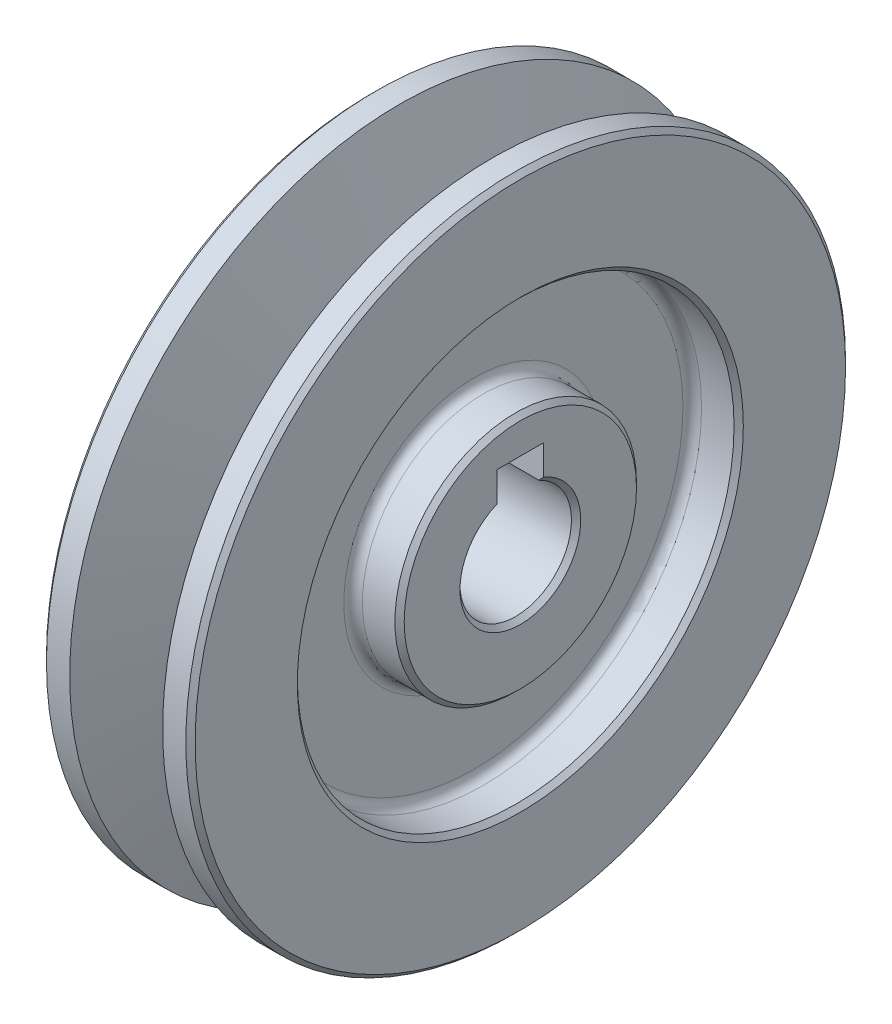
ISO-10303-21;
HEADER;
FILE_DESCRIPTION(('STEP AP214'),'2;1');
FILE_NAME('part.step','',(''),(''),'','','');
FILE_SCHEMA(('AUTOMOTIVE_DESIGN { 1 0 10303 214 1 1 1 1 }'));
ENDSEC;
DATA;
#1=APPLICATION_CONTEXT('core data for automotive mechanical design processes');
#2=APPLICATION_PROTOCOL_DEFINITION('international standard','automotive_design',2000,#1);
#3=PRODUCT_CONTEXT('',#1,'mechanical');
#4=PRODUCT('Part','Part','',(#3));
#5=PRODUCT_RELATED_PRODUCT_CATEGORY('part','',(#4));
#6=PRODUCT_DEFINITION_FORMATION('','',#4);
#7=PRODUCT_DEFINITION_CONTEXT('part definition',#1,'design');
#8=PRODUCT_DEFINITION('design','',#6,#7);
#9=PRODUCT_DEFINITION_SHAPE('','',#8);
#10=(LENGTH_UNIT() NAMED_UNIT(*) SI_UNIT(.MILLI.,.METRE.));
#11=(NAMED_UNIT(*) PLANE_ANGLE_UNIT() SI_UNIT($,.RADIAN.));
#12=(NAMED_UNIT(*) SI_UNIT($,.STERADIAN.) SOLID_ANGLE_UNIT());
#13=UNCERTAINTY_MEASURE_WITH_UNIT(LENGTH_MEASURE(1.E-05),#10,'distance_accuracy_value','');
#14=(GEOMETRIC_REPRESENTATION_CONTEXT(3) GLOBAL_UNCERTAINTY_ASSIGNED_CONTEXT((#13)) GLOBAL_UNIT_ASSIGNED_CONTEXT((#10,
#11,#12)) REPRESENTATION_CONTEXT('',''));
#15=CARTESIAN_POINT('',(0.,0.,0.));
#16=DIRECTION('',(0.,0.,1.));
#17=DIRECTION('',(1.,0.,0.));
#18=AXIS2_PLACEMENT_3D('',#15,#16,#17);
#19=CARTESIAN_POINT('',(0.,0.,0.));
#20=DIRECTION('',(1.,0.,0.));
#21=DIRECTION('',(0.,0.,-1.));
#22=AXIS2_PLACEMENT_3D('',#19,#20,#21);
#23=CYLINDRICAL_SURFACE('',#22,35.5);
#24=CARTESIAN_POINT('',(-7.49999999999999,0.,0.));
#25=DIRECTION('',(-1.,0.,0.));
#26=DIRECTION('',(0.,0.,1.));
#27=AXIS2_PLACEMENT_3D('',#24,#25,#26);
#28=CIRCLE('',#27,35.5);
#29=CARTESIAN_POINT('',(-7.49999999999999,0.,35.5));
#30=VERTEX_POINT('',#29);
#31=EDGE_CURVE('E319',#30,#30,#28,.F.);
#32=ORIENTED_EDGE('',*,*,#31,.T.);
#33=EDGE_LOOP('',(#32));
#34=FACE_BOUND('',#33,.T.);
#35=CARTESIAN_POINT('',(-5.,0.,0.));
#36=DIRECTION('',(1.,0.,0.));
#37=DIRECTION('',(0.,0.,-1.));
#38=AXIS2_PLACEMENT_3D('',#35,#36,#37);
#39=CIRCLE('',#38,35.5);
#40=CARTESIAN_POINT('',(-5.,0.,-35.5));
#41=VERTEX_POINT('',#40);
#42=EDGE_CURVE('E367',#41,#41,#39,.T.);
#43=ORIENTED_EDGE('',*,*,#42,.F.);
#44=EDGE_LOOP('',(#43));
#45=FACE_BOUND('',#44,.T.);
#46=ADVANCED_FACE('F38',(#34,#45),#23,.T.);
#47=CARTESIAN_POINT('',(-1.94269318541343,0.,0.));
#48=DIRECTION('',(-1.,0.,0.));
#49=DIRECTION('',(0.,0.,1.));
#50=AXIS2_PLACEMENT_3D('',#47,#48,#49);
#51=CONICAL_SURFACE('',#50,25.5,1.27409035395586);
#52=ORIENTED_EDGE('',*,*,#42,.T.);
#53=EDGE_LOOP('',(#52));
#54=FACE_BOUND('',#53,.T.);
#55=CARTESIAN_POINT('',(-1.94269318541343,0.,0.));
#56=DIRECTION('',(1.,0.,0.));
#57=DIRECTION('',(0.,0.,-1.));
#58=AXIS2_PLACEMENT_3D('',#55,#56,#57);
#59=CIRCLE('',#58,25.5);
#60=CARTESIAN_POINT('',(-1.94269318541343,0.,-25.5));
#61=VERTEX_POINT('',#60);
#62=EDGE_CURVE('E370',#61,#61,#59,.T.);
#63=ORIENTED_EDGE('',*,*,#62,.F.);
#64=EDGE_LOOP('',(#63));
#65=FACE_BOUND('',#64,.T.);
#66=ADVANCED_FACE('F213',(#54,#65),#51,.T.);
#67=CARTESIAN_POINT('',(0.,0.,0.));
#68=DIRECTION('',(1.,0.,0.));
#69=DIRECTION('',(0.,0.,-1.));
#70=AXIS2_PLACEMENT_3D('',#67,#68,#69);
#71=CYLINDRICAL_SURFACE('',#70,25.5);
#72=ORIENTED_EDGE('',*,*,#62,.T.);
#73=EDGE_LOOP('',(#72));
#74=FACE_BOUND('',#73,.T.);
#75=CARTESIAN_POINT('',(1.94269318541343,0.,0.));
#76=DIRECTION('',(1.,0.,0.));
#77=DIRECTION('',(0.,0.,-1.));
#78=AXIS2_PLACEMENT_3D('',#75,#76,#77);
#79=CIRCLE('',#78,25.5);
#80=CARTESIAN_POINT('',(1.94269318541343,0.,-25.5));
#81=VERTEX_POINT('',#80);
#82=EDGE_CURVE('E373',#81,#81,#79,.T.);
#83=ORIENTED_EDGE('',*,*,#82,.F.);
#84=EDGE_LOOP('',(#83));
#85=FACE_BOUND('',#84,.T.);
#86=ADVANCED_FACE('F218',(#74,#85),#71,.T.);
#87=CARTESIAN_POINT('',(5.,0.,0.));
#88=DIRECTION('',(1.,0.,0.));
#89=DIRECTION('',(0.,0.,-1.));
#90=AXIS2_PLACEMENT_3D('',#87,#88,#89);
#91=CONICAL_SURFACE('',#90,35.5,1.27409035395586);
#92=ORIENTED_EDGE('',*,*,#82,.T.);
#93=EDGE_LOOP('',(#92));
#94=FACE_BOUND('',#93,.T.);
#95=CARTESIAN_POINT('',(5.,0.,0.));
#96=DIRECTION('',(1.,0.,0.));
#97=DIRECTION('',(0.,0.,-1.));
#98=AXIS2_PLACEMENT_3D('',#95,#96,#97);
#99=CIRCLE('',#98,35.5);
#100=CARTESIAN_POINT('',(5.,0.,-35.5));
#101=VERTEX_POINT('',#100);
#102=EDGE_CURVE('E376',#101,#101,#99,.T.);
#103=ORIENTED_EDGE('',*,*,#102,.F.);
#104=EDGE_LOOP('',(#103));
#105=FACE_BOUND('',#104,.T.);
#106=ADVANCED_FACE('F226',(#94,#105),#91,.T.);
#107=CARTESIAN_POINT('',(0.,0.,0.));
#108=DIRECTION('',(1.,0.,0.));
#109=DIRECTION('',(0.,0.,-1.));
#110=AXIS2_PLACEMENT_3D('',#107,#108,#109);
#111=CYLINDRICAL_SURFACE('',#110,35.5);
#112=CARTESIAN_POINT('',(7.50000000000002,0.,0.));
#113=DIRECTION('',(1.,0.,0.));
#114=DIRECTION('',(0.,0.,-1.));
#115=AXIS2_PLACEMENT_3D('',#112,#113,#114);
#116=CIRCLE('',#115,35.5);
#117=CARTESIAN_POINT('',(7.50000000000002,0.,-35.5));
#118=VERTEX_POINT('',#117);
#119=EDGE_CURVE('E305',#118,#118,#116,.F.);
#120=ORIENTED_EDGE('',*,*,#119,.T.);
#121=EDGE_LOOP('',(#120));
#122=FACE_BOUND('',#121,.T.);
#123=ORIENTED_EDGE('',*,*,#102,.T.);
#124=EDGE_LOOP('',(#123));
#125=FACE_BOUND('',#124,.T.);
#126=ADVANCED_FACE('F230',(#122,#125),#111,.T.);
#127=CARTESIAN_POINT('',(8.,0.,-35.5));
#128=DIRECTION('',(1.,0.,0.));
#129=DIRECTION('',(0.,0.,-1.));
#130=AXIS2_PLACEMENT_3D('',#127,#128,#129);
#131=PLANE('',#130);
#132=CARTESIAN_POINT('',(8.,0.,0.));
#133=DIRECTION('',(1.,0.,0.));
#134=DIRECTION('',(0.,0.,-1.));
#135=AXIS2_PLACEMENT_3D('',#132,#133,#134);
#136=CIRCLE('',#135,24.);
#137=CARTESIAN_POINT('',(8.,0.,-24.));
#138=VERTEX_POINT('',#137);
#139=EDGE_CURVE('E11',#138,#138,#136,.F.);
#140=ORIENTED_EDGE('',*,*,#139,.T.);
#141=EDGE_LOOP('',(#140));
#142=FACE_BOUND('',#141,.T.);
#143=CARTESIAN_POINT('',(8.,0.,0.));
#144=DIRECTION('',(1.,0.,0.));
#145=DIRECTION('',(0.,0.,-1.));
#146=AXIS2_PLACEMENT_3D('',#143,#144,#145);
#147=CIRCLE('',#146,35.);
#148=CARTESIAN_POINT('',(8.,0.,-35.));
#149=VERTEX_POINT('',#148);
#150=EDGE_CURVE('E310',#149,#149,#147,.T.);
#151=ORIENTED_EDGE('',*,*,#150,.T.);
#152=EDGE_LOOP('',(#151));
#153=FACE_BOUND('',#152,.T.);
#154=ADVANCED_FACE('F234',(#142,#153),#131,.T.);
#155=CARTESIAN_POINT('',(0.,0.,0.));
#156=DIRECTION('',(1.,0.,0.));
#157=DIRECTION('',(0.,0.,-1.));
#158=AXIS2_PLACEMENT_3D('',#155,#156,#157);
#159=CYLINDRICAL_SURFACE('',#158,23.5);
#160=CARTESIAN_POINT('',(7.49999999999998,0.,0.));
#161=DIRECTION('',(1.,0.,0.));
#162=DIRECTION('',(0.,0.,-1.));
#163=AXIS2_PLACEMENT_3D('',#160,#161,#162);
#164=CIRCLE('',#163,23.5);
#165=CARTESIAN_POINT('',(7.49999999999998,0.,-23.5));
#166=VERTEX_POINT('',#165);
#167=EDGE_CURVE('E47',#166,#166,#164,.T.);
#168=ORIENTED_EDGE('',*,*,#167,.T.);
#169=EDGE_LOOP('',(#168));
#170=FACE_BOUND('',#169,.T.);
#171=CARTESIAN_POINT('',(4.,0.,0.));
#172=DIRECTION('',(1.,0.,0.));
#173=DIRECTION('',(0.,0.,-1.));
#174=AXIS2_PLACEMENT_3D('',#171,#172,#173);
#175=CIRCLE('',#174,23.5);
#176=CARTESIAN_POINT('',(4.,0.,-23.5));
#177=VERTEX_POINT('',#176);
#178=EDGE_CURVE('E341',#177,#177,#175,.F.);
#179=ORIENTED_EDGE('',*,*,#178,.T.);
#180=EDGE_LOOP('',(#179));
#181=FACE_BOUND('',#180,.T.);
#182=ADVANCED_FACE('F238',(#170,#181),#159,.F.);
#183=CARTESIAN_POINT('',(3.,0.,-23.5));
#184=DIRECTION('',(1.,0.,0.));
#185=DIRECTION('',(0.,0.,-1.));
#186=AXIS2_PLACEMENT_3D('',#183,#184,#185);
#187=PLANE('',#186);
#188=CARTESIAN_POINT('',(3.,0.,0.));
#189=DIRECTION('',(1.,0.,0.));
#190=DIRECTION('',(0.,0.,-1.));
#191=AXIS2_PLACEMENT_3D('',#188,#189,#190);
#192=CIRCLE('',#191,14.);
#193=CARTESIAN_POINT('',(3.,0.,-14.));
#194=VERTEX_POINT('',#193);
#195=EDGE_CURVE('E336',#194,#194,#192,.F.);
#196=ORIENTED_EDGE('',*,*,#195,.T.);
#197=EDGE_LOOP('',(#196));
#198=FACE_BOUND('',#197,.T.);
#199=CARTESIAN_POINT('',(3.,0.,0.));
#200=DIRECTION('',(1.,0.,0.));
#201=DIRECTION('',(0.,0.,-1.));
#202=AXIS2_PLACEMENT_3D('',#199,#200,#201);
#203=CIRCLE('',#202,22.5);
#204=CARTESIAN_POINT('',(3.,0.,-22.5));
#205=VERTEX_POINT('',#204);
#206=EDGE_CURVE('E333',#205,#205,#203,.T.);
#207=ORIENTED_EDGE('',*,*,#206,.T.);
#208=EDGE_LOOP('',(#207));
#209=FACE_BOUND('',#208,.T.);
#210=ADVANCED_FACE('F242',(#198,#209),#187,.T.);
#211=CARTESIAN_POINT('',(0.,0.,0.));
#212=DIRECTION('',(1.,0.,0.));
#213=DIRECTION('',(0.,0.,-1.));
#214=AXIS2_PLACEMENT_3D('',#211,#212,#213);
#215=CYLINDRICAL_SURFACE('',#214,13.);
#216=CARTESIAN_POINT('',(4.,0.,0.));
#217=DIRECTION('',(1.,0.,0.));
#218=DIRECTION('',(0.,0.,-1.));
#219=AXIS2_PLACEMENT_3D('',#216,#217,#218);
#220=CIRCLE('',#219,13.);
#221=CARTESIAN_POINT('',(4.,0.,-13.));
#222=VERTEX_POINT('',#221);
#223=EDGE_CURVE('E331',#222,#222,#220,.T.);
#224=ORIENTED_EDGE('',*,*,#223,.T.);
#225=EDGE_LOOP('',(#224));
#226=FACE_BOUND('',#225,.T.);
#227=CARTESIAN_POINT('',(7.50000000000002,0.,0.));
#228=DIRECTION('',(1.,0.,0.));
#229=DIRECTION('',(0.,0.,-1.));
#230=AXIS2_PLACEMENT_3D('',#227,#228,#229);
#231=CIRCLE('',#230,13.);
#232=CARTESIAN_POINT('',(7.50000000000002,0.,-13.));
#233=VERTEX_POINT('',#232);
#234=EDGE_CURVE('E354',#233,#233,#231,.F.);
#235=ORIENTED_EDGE('',*,*,#234,.T.);
#236=EDGE_LOOP('',(#235));
#237=FACE_BOUND('',#236,.T.);
#238=ADVANCED_FACE('F246',(#226,#237),#215,.T.);
#239=CARTESIAN_POINT('',(8.,0.,-13.));
#240=DIRECTION('',(1.,0.,0.));
#241=DIRECTION('',(0.,0.,-1.));
#242=AXIS2_PLACEMENT_3D('',#239,#240,#241);
#243=PLANE('',#242);
#244=DIRECTION('',(0.,-1.,0.));
#245=VECTOR('',#244,1.);
#246=CARTESIAN_POINT('',(8.,9.2,2.5));
#247=LINE('',#246,#245);
#248=CARTESIAN_POINT('',(8.,9.2,2.5));
#249=VERTEX_POINT('',#248);
#250=CARTESIAN_POINT('',(8.,6.00000000000001,2.5));
#251=VERTEX_POINT('',#250);
#252=EDGE_CURVE('E113',#249,#251,#247,.T.);
#253=ORIENTED_EDGE('',*,*,#252,.F.);
#254=DIRECTION('',(0.,0.,1.));
#255=VECTOR('',#254,1.);
#256=CARTESIAN_POINT('',(8.,9.2,2.5));
#257=LINE('',#256,#255);
#258=CARTESIAN_POINT('',(8.,9.2,-2.5));
#259=VERTEX_POINT('',#258);
#260=EDGE_CURVE('E115',#259,#249,#257,.T.);
#261=ORIENTED_EDGE('',*,*,#260,.F.);
#262=DIRECTION('',(0.,1.,0.));
#263=VECTOR('',#262,1.);
#264=CARTESIAN_POINT('',(8.,9.2,-2.5));
#265=LINE('',#264,#263);
#266=CARTESIAN_POINT('',(8.,6.00000000000001,-2.5));
#267=VERTEX_POINT('',#266);
#268=EDGE_CURVE('E94',#267,#259,#265,.T.);
#269=ORIENTED_EDGE('',*,*,#268,.F.);
#270=CARTESIAN_POINT('',(8.,0.,0.));
#271=DIRECTION('',(1.,0.,0.));
#272=DIRECTION('',(0.,0.,-1.));
#273=AXIS2_PLACEMENT_3D('',#270,#271,#272);
#274=CIRCLE('',#273,6.50000000000001);
#275=EDGE_CURVE('E356',#267,#251,#274,.F.);
#276=ORIENTED_EDGE('',*,*,#275,.T.);
#277=EDGE_LOOP('',(#253,#261,#269,#276));
#278=FACE_BOUND('',#277,.T.);
#279=CARTESIAN_POINT('',(8.,0.,0.));
#280=DIRECTION('',(1.,0.,0.));
#281=DIRECTION('',(0.,0.,-1.));
#282=AXIS2_PLACEMENT_3D('',#279,#280,#281);
#283=CIRCLE('',#282,12.5);
#284=CARTESIAN_POINT('',(8.,0.,-12.5));
#285=VERTEX_POINT('',#284);
#286=EDGE_CURVE('E360',#285,#285,#283,.T.);
#287=ORIENTED_EDGE('',*,*,#286,.T.);
#288=EDGE_LOOP('',(#287));
#289=FACE_BOUND('',#288,.T.);
#290=ADVANCED_FACE('F250',(#278,#289),#243,.T.);
#291=CARTESIAN_POINT('',(0.,0.,0.));
#292=DIRECTION('',(1.,0.,0.));
#293=DIRECTION('',(0.,0.,-1.));
#294=AXIS2_PLACEMENT_3D('',#291,#292,#293);
#295=CYLINDRICAL_SURFACE('',#294,6.);
#296=DIRECTION('',(1.,0.,0.));
#297=VECTOR('',#296,1.);
#298=CARTESIAN_POINT('',(0.,5.45435605731786,2.5));
#299=LINE('',#298,#297);
#300=CARTESIAN_POINT('',(7.49999999999999,5.45435605731786,2.5));
#301=VERTEX_POINT('',#300);
#302=CARTESIAN_POINT('',(-7.50000000000001,5.4543560573179,2.5));
#303=VERTEX_POINT('',#302);
#304=EDGE_CURVE('E132',#301,#303,#299,.F.);
#305=ORIENTED_EDGE('',*,*,#304,.F.);
#306=CARTESIAN_POINT('',(7.49999999999999,0.,0.));
#307=DIRECTION('',(1.,0.,0.));
#308=DIRECTION('',(0.,0.,-1.));
#309=AXIS2_PLACEMENT_3D('',#306,#307,#308);
#310=CIRCLE('',#309,6.);
#311=CARTESIAN_POINT('',(7.49999999999999,5.45435605731786,-2.5));
#312=VERTEX_POINT('',#311);
#313=EDGE_CURVE('E365',#301,#312,#310,.T.);
#314=ORIENTED_EDGE('',*,*,#313,.T.);
#315=DIRECTION('',(1.,0.,0.));
#316=VECTOR('',#315,1.);
#317=CARTESIAN_POINT('',(0.,5.45435605731786,-2.5));
#318=LINE('',#317,#316);
#319=CARTESIAN_POINT('',(-7.49999999999999,5.45435605731786,-2.5));
#320=VERTEX_POINT('',#319);
#321=EDGE_CURVE('E121',#320,#312,#318,.T.);
#322=ORIENTED_EDGE('',*,*,#321,.F.);
#323=CARTESIAN_POINT('',(-7.49999999999999,0.,0.));
#324=DIRECTION('',(-1.,0.,0.));
#325=DIRECTION('',(0.,0.,1.));
#326=AXIS2_PLACEMENT_3D('',#323,#324,#325);
#327=CIRCLE('',#326,6.);
#328=EDGE_CURVE('E316',#320,#303,#327,.T.);
#329=ORIENTED_EDGE('',*,*,#328,.T.);
#330=EDGE_LOOP('',(#305,#314,#322,#329));
#331=FACE_BOUND('',#330,.T.);
#332=ADVANCED_FACE('F254',(#331),#295,.F.);
#333=CARTESIAN_POINT('',(-8.,0.,-6.));
#334=DIRECTION('',(-1.,0.,0.));
#335=DIRECTION('',(0.,0.,1.));
#336=AXIS2_PLACEMENT_3D('',#333,#334,#335);
#337=PLANE('',#336);
#338=DIRECTION('',(0.,-1.,0.));
#339=VECTOR('',#338,1.);
#340=CARTESIAN_POINT('',(-8.,9.2,2.5));
#341=LINE('',#340,#339);
#342=CARTESIAN_POINT('',(-8.,9.2,2.5));
#343=VERTEX_POINT('',#342);
#344=CARTESIAN_POINT('',(-8.,6.00000000000002,2.5));
#345=VERTEX_POINT('',#344);
#346=EDGE_CURVE('E99',#343,#345,#341,.T.);
#347=ORIENTED_EDGE('',*,*,#346,.T.);
#348=CARTESIAN_POINT('',(-8.,0.,0.));
#349=DIRECTION('',(-1.,0.,0.));
#350=DIRECTION('',(0.,0.,1.));
#351=AXIS2_PLACEMENT_3D('',#348,#349,#350);
#352=CIRCLE('',#351,6.50000000000002);
#353=CARTESIAN_POINT('',(-8.,6.00000000000002,-2.5));
#354=VERTEX_POINT('',#353);
#355=EDGE_CURVE('E112',#345,#354,#352,.F.);
#356=ORIENTED_EDGE('',*,*,#355,.T.);
#357=DIRECTION('',(0.,1.,0.));
#358=VECTOR('',#357,1.);
#359=CARTESIAN_POINT('',(-8.,4.68945343674492,-2.5));
#360=LINE('',#359,#358);
#361=CARTESIAN_POINT('',(-8.,9.2,-2.5));
#362=VERTEX_POINT('',#361);
#363=EDGE_CURVE('E54',#354,#362,#360,.T.);
#364=ORIENTED_EDGE('',*,*,#363,.T.);
#365=DIRECTION('',(0.,0.,1.));
#366=VECTOR('',#365,1.);
#367=CARTESIAN_POINT('',(-8.,9.2,2.5));
#368=LINE('',#367,#366);
#369=EDGE_CURVE('E102',#362,#343,#368,.T.);
#370=ORIENTED_EDGE('',*,*,#369,.T.);
#371=EDGE_LOOP('',(#347,#356,#364,#370));
#372=FACE_BOUND('',#371,.T.);
#373=CARTESIAN_POINT('',(-8.,0.,0.));
#374=DIRECTION('',(-1.,0.,0.));
#375=DIRECTION('',(0.,0.,1.));
#376=AXIS2_PLACEMENT_3D('',#373,#374,#375);
#377=CIRCLE('',#376,12.5);
#378=CARTESIAN_POINT('',(-8.,0.,12.5));
#379=VERTEX_POINT('',#378);
#380=EDGE_CURVE('E307',#379,#379,#377,.T.);
#381=ORIENTED_EDGE('',*,*,#380,.T.);
#382=EDGE_LOOP('',(#381));
#383=FACE_BOUND('',#382,.T.);
#384=ADVANCED_FACE('F109',(#372,#383),#337,.T.);
#385=CARTESIAN_POINT('',(0.,0.,0.));
#386=DIRECTION('',(1.,0.,0.));
#387=DIRECTION('',(0.,0.,-1.));
#388=AXIS2_PLACEMENT_3D('',#385,#386,#387);
#389=CYLINDRICAL_SURFACE('',#388,13.);
#390=CARTESIAN_POINT('',(-4.,0.,0.));
#391=DIRECTION('',(-1.,0.,0.));
#392=DIRECTION('',(0.,0.,1.));
#393=AXIS2_PLACEMENT_3D('',#390,#391,#392);
#394=CIRCLE('',#393,13.);
#395=CARTESIAN_POINT('',(-4.,0.,13.));
#396=VERTEX_POINT('',#395);
#397=EDGE_CURVE('E158',#396,#396,#394,.T.);
#398=ORIENTED_EDGE('',*,*,#397,.T.);
#399=EDGE_LOOP('',(#398));
#400=FACE_BOUND('',#399,.T.);
#401=CARTESIAN_POINT('',(-7.50000000000002,0.,0.));
#402=DIRECTION('',(-1.,0.,0.));
#403=DIRECTION('',(0.,0.,1.));
#404=AXIS2_PLACEMENT_3D('',#401,#402,#403);
#405=CIRCLE('',#404,13.);
#406=CARTESIAN_POINT('',(-7.50000000000002,0.,13.));
#407=VERTEX_POINT('',#406);
#408=EDGE_CURVE('E303',#407,#407,#405,.F.);
#409=ORIENTED_EDGE('',*,*,#408,.T.);
#410=EDGE_LOOP('',(#409));
#411=FACE_BOUND('',#410,.T.);
#412=ADVANCED_FACE('F261',(#400,#411),#389,.T.);
#413=CARTESIAN_POINT('',(-3.,0.,-13.));
#414=DIRECTION('',(-1.,0.,0.));
#415=DIRECTION('',(0.,0.,1.));
#416=AXIS2_PLACEMENT_3D('',#413,#414,#415);
#417=PLANE('',#416);
#418=CARTESIAN_POINT('',(-3.,0.,0.));
#419=DIRECTION('',(-1.,0.,0.));
#420=DIRECTION('',(0.,0.,1.));
#421=AXIS2_PLACEMENT_3D('',#418,#419,#420);
#422=CIRCLE('',#421,22.5);
#423=CARTESIAN_POINT('',(-3.,0.,22.5));
#424=VERTEX_POINT('',#423);
#425=EDGE_CURVE('E292',#424,#424,#422,.T.);
#426=ORIENTED_EDGE('',*,*,#425,.T.);
#427=EDGE_LOOP('',(#426));
#428=FACE_BOUND('',#427,.T.);
#429=CARTESIAN_POINT('',(-3.,0.,0.));
#430=DIRECTION('',(-1.,0.,0.));
#431=DIRECTION('',(0.,0.,1.));
#432=AXIS2_PLACEMENT_3D('',#429,#430,#431);
#433=CIRCLE('',#432,14.);
#434=CARTESIAN_POINT('',(-3.,0.,14.));
#435=VERTEX_POINT('',#434);
#436=EDGE_CURVE('E284',#435,#435,#433,.F.);
#437=ORIENTED_EDGE('',*,*,#436,.T.);
#438=EDGE_LOOP('',(#437));
#439=FACE_BOUND('',#438,.T.);
#440=ADVANCED_FACE('F264',(#428,#439),#417,.T.);
#441=CARTESIAN_POINT('',(0.,0.,0.));
#442=DIRECTION('',(1.,0.,0.));
#443=DIRECTION('',(0.,0.,-1.));
#444=AXIS2_PLACEMENT_3D('',#441,#442,#443);
#445=CYLINDRICAL_SURFACE('',#444,23.5);
#446=CARTESIAN_POINT('',(-4.,0.,0.));
#447=DIRECTION('',(-1.,0.,0.));
#448=DIRECTION('',(0.,0.,1.));
#449=AXIS2_PLACEMENT_3D('',#446,#447,#448);
#450=CIRCLE('',#449,23.5);
#451=CARTESIAN_POINT('',(-4.,0.,23.5));
#452=VERTEX_POINT('',#451);
#453=EDGE_CURVE('E278',#452,#452,#450,.F.);
#454=ORIENTED_EDGE('',*,*,#453,.T.);
#455=EDGE_LOOP('',(#454));
#456=FACE_BOUND('',#455,.T.);
#457=CARTESIAN_POINT('',(-7.49999999999997,0.,0.));
#458=DIRECTION('',(-1.,0.,0.));
#459=DIRECTION('',(0.,0.,1.));
#460=AXIS2_PLACEMENT_3D('',#457,#458,#459);
#461=CIRCLE('',#460,23.5);
#462=CARTESIAN_POINT('',(-7.49999999999997,0.,23.5));
#463=VERTEX_POINT('',#462);
#464=EDGE_CURVE('E281',#463,#463,#461,.T.);
#465=ORIENTED_EDGE('',*,*,#464,.T.);
#466=EDGE_LOOP('',(#465));
#467=FACE_BOUND('',#466,.T.);
#468=ADVANCED_FACE('F267',(#456,#467),#445,.F.);
#469=CARTESIAN_POINT('',(-8.,0.,-35.5));
#470=DIRECTION('',(-1.,0.,0.));
#471=DIRECTION('',(0.,0.,1.));
#472=AXIS2_PLACEMENT_3D('',#469,#470,#471);
#473=PLANE('',#472);
#474=CARTESIAN_POINT('',(-8.,0.,0.));
#475=DIRECTION('',(-1.,0.,0.));
#476=DIRECTION('',(0.,0.,1.));
#477=AXIS2_PLACEMENT_3D('',#474,#475,#476);
#478=CIRCLE('',#477,35.);
#479=CARTESIAN_POINT('',(-8.,0.,35.));
#480=VERTEX_POINT('',#479);
#481=EDGE_CURVE('E282',#480,#480,#478,.T.);
#482=ORIENTED_EDGE('',*,*,#481,.T.);
#483=EDGE_LOOP('',(#482));
#484=FACE_BOUND('',#483,.T.);
#485=CARTESIAN_POINT('',(-8.,0.,0.));
#486=DIRECTION('',(-1.,0.,0.));
#487=DIRECTION('',(0.,0.,1.));
#488=AXIS2_PLACEMENT_3D('',#485,#486,#487);
#489=CIRCLE('',#488,24.);
#490=CARTESIAN_POINT('',(-8.,0.,24.));
#491=VERTEX_POINT('',#490);
#492=EDGE_CURVE('E287',#491,#491,#489,.F.);
#493=ORIENTED_EDGE('',*,*,#492,.T.);
#494=EDGE_LOOP('',(#493));
#495=FACE_BOUND('',#494,.T.);
#496=ADVANCED_FACE('F145',(#484,#495),#473,.T.);
#497=CARTESIAN_POINT('',(7.49999999999999,0.,0.));
#498=DIRECTION('',(1.,0.,0.));
#499=DIRECTION('',(0.,0.,-1.));
#500=AXIS2_PLACEMENT_3D('',#497,#498,#499);
#501=CONICAL_SURFACE('',#500,6.,0.785398163397441);
#502=CARTESIAN_POINT('',(9.87851809279334,7.996847218202,2.5));
#503=CARTESIAN_POINT('',(9.69561827611088,7.80520044614911,2.5));
#504=CARTESIAN_POINT('',(9.5130073335574,7.61327653402442,2.5));
#505=CARTESIAN_POINT('',(9.14855219902151,7.22870604888692,2.5));
#506=CARTESIAN_POINT('',(8.96670799917428,7.03605948332519,2.5));
#507=CARTESIAN_POINT('',(8.60404204743516,6.64994639611863,2.5));
#508=CARTESIAN_POINT('',(8.42321992575596,6.45648022211701,2.5));
#509=CARTESIAN_POINT('',(8.06279838271433,6.06840260436788,2.5));
#510=CARTESIAN_POINT('',(7.88319898960132,5.87379113435229,2.5));
#511=CARTESIAN_POINT('',(7.52554607774594,5.48301097494807,2.5));
#512=CARTESIAN_POINT('',(7.34749319295693,5.28684170472391,2.5));
#513=CARTESIAN_POINT('',(6.99358157546478,4.8925481062318,2.5));
#514=CARTESIAN_POINT('',(6.81772271175028,4.69442389597646,2.5));
#515=CARTESIAN_POINT('',(6.55620812543917,4.39517613706631,2.5));
#516=CARTESIAN_POINT('',(6.46939751014354,4.29506201434628,2.5));
#517=CARTESIAN_POINT('',(6.29671225385518,4.09403209186591,2.5));
#518=CARTESIAN_POINT('',(6.21083759609687,3.99311630652171,2.5));
#519=CARTESIAN_POINT('',(6.04020215400039,3.79031073202054,2.5));
#520=CARTESIAN_POINT('',(5.95544159505808,3.68842075276124,2.5));
#521=CARTESIAN_POINT('',(5.78733115235289,3.48347406734019,2.5));
#522=CARTESIAN_POINT('',(5.70398135652027,3.38041728911725,2.5));
#523=CARTESIAN_POINT('',(5.62148190720665,3.27667714482707,2.5));
#524=B_SPLINE_CURVE_WITH_KNOTS('',3,(#502,#503,#504,#505,#506,#507,#508,#509,#510,#511,#512,
#513,#514,#515,#516,#517,#518,#519,#520,#521,#522,#523),.UNSPECIFIED.,.F.,.F.,(4,2,2,2,2,2,2,2,
2,2,4),(0.,0.794751211136146,1.58949425022396,2.38392852041293,3.17838108301331,
3.97314524653587,4.76786172303218,5.16538739146731,5.56290592737695,5.96050368522883,
6.35812613402777),.UNSPECIFIED.);
#525=EDGE_CURVE('E62',#251,#301,#524,.T.);
#526=ORIENTED_EDGE('',*,*,#525,.F.);
#527=ORIENTED_EDGE('',*,*,#275,.F.);
#528=CARTESIAN_POINT('',(5.62148190720664,3.27667714482706,-2.5));
#529=CARTESIAN_POINT('',(5.68423462608521,3.3555999877722,-2.5));
#530=CARTESIAN_POINT('',(5.74748764959992,3.4341219087837,-2.5));
#531=CARTESIAN_POINT('',(5.87485352934888,3.59046116823555,-2.5));
#532=CARTESIAN_POINT('',(5.9389663557458,3.66827853096967,-2.5));
#533=CARTESIAN_POINT('',(6.13237272244433,3.90080708242088,-2.5));
#534=CARTESIAN_POINT('',(6.26275100510174,4.05461578565748,-2.5));
#535=CARTESIAN_POINT('',(6.52559307541641,4.36035182254918,-2.5));
#536=CARTESIAN_POINT('',(6.65805621189684,4.51227971816509,-2.5));
#537=CARTESIAN_POINT('',(6.92460741261318,4.81471172570076,-2.5));
#538=CARTESIAN_POINT('',(7.05869554016978,4.96521578172852,-2.5));
#539=CARTESIAN_POINT('',(7.46269843747693,5.4149083727013,-2.5));
#540=CARTESIAN_POINT('',(7.73447669189982,5.71242116428814,-2.5));
#541=CARTESIAN_POINT('',(8.28119506085875,6.30455479295837,-2.5));
#542=CARTESIAN_POINT('',(8.55613540608599,6.59917541609902,-2.5));
#543=CARTESIAN_POINT('',(8.91897175935182,6.98513549258517,-2.5));
#544=CARTESIAN_POINT('',(9.00589814622697,7.07738820553484,-2.5));
#545=CARTESIAN_POINT('',(9.17994156895429,7.26170966899727,-2.5));
#546=CARTESIAN_POINT('',(9.26705860037213,7.35377842369551,-2.5));
#547=CARTESIAN_POINT('',(9.44147570394517,7.53776447789106,-2.5));
#548=CARTESIAN_POINT('',(9.52877579788304,7.629681756732,-2.5));
#549=CARTESIAN_POINT('',(9.70353347363674,7.81337054151767,-2.5));
#550=CARTESIAN_POINT('',(9.79099105905022,7.90514204403988,-2.5));
#551=CARTESIAN_POINT('',(9.87851809279334,7.996847218202,-2.5));
#552=B_SPLINE_CURVE_WITH_KNOTS('',3,(#528,#529,#530,#531,#532,#533,#534,#535,#536,#537,#538,
#539,#540,#541,#542,#543,#544,#545,#546,#547,#548,#549,#550,#551),.UNSPECIFIED.,.F.,.F.,(4,2,2,
2,2,2,2,2,2,2,2,4),(0.,0.302484700999519,0.604958932042222,1.20982650668278,1.81450876720095,
2.41921466649161,3.62805492921317,4.83698394980241,5.21724797492641,5.59750324731651,
5.97780667418521,6.35811890158821),.UNSPECIFIED.);
#553=EDGE_CURVE('E124',#312,#267,#552,.T.);
#554=ORIENTED_EDGE('',*,*,#553,.F.);
#555=ORIENTED_EDGE('',*,*,#313,.F.);
#556=EDGE_LOOP('',(#526,#527,#554,#555));
#557=FACE_BOUND('',#556,.T.);
#558=ADVANCED_FACE('F135',(#557),#501,.F.);
#559=CARTESIAN_POINT('',(8.,0.,0.));
#560=DIRECTION('',(-1.,0.,0.));
#561=DIRECTION('',(0.,0.,1.));
#562=AXIS2_PLACEMENT_3D('',#559,#560,#561);
#563=CONICAL_SURFACE('',#562,12.5,0.785398163397443);
#564=ORIENTED_EDGE('',*,*,#234,.F.);
#565=EDGE_LOOP('',(#564));
#566=FACE_BOUND('',#565,.T.);
#567=ORIENTED_EDGE('',*,*,#286,.F.);
#568=EDGE_LOOP('',(#567));
#569=FACE_BOUND('',#568,.T.);
#570=ADVANCED_FACE('F499',(#566,#569),#563,.T.);
#571=CARTESIAN_POINT('',(8.,0.,0.));
#572=DIRECTION('',(-1.,0.,0.));
#573=DIRECTION('',(0.,0.,1.));
#574=AXIS2_PLACEMENT_3D('',#571,#572,#573);
#575=CONICAL_SURFACE('',#574,35.,0.785398163397448);
#576=ORIENTED_EDGE('',*,*,#119,.F.);
#577=EDGE_LOOP('',(#576));
#578=FACE_BOUND('',#577,.T.);
#579=ORIENTED_EDGE('',*,*,#150,.F.);
#580=EDGE_LOOP('',(#579));
#581=FACE_BOUND('',#580,.T.);
#582=ADVANCED_FACE('F511',(#578,#581),#575,.T.);
#583=CARTESIAN_POINT('',(-7.50000000000002,0.,0.));
#584=DIRECTION('',(1.,0.,0.));
#585=DIRECTION('',(0.,0.,-1.));
#586=AXIS2_PLACEMENT_3D('',#583,#584,#585);
#587=CONICAL_SURFACE('',#586,13.,0.785398163397447);
#588=ORIENTED_EDGE('',*,*,#380,.F.);
#589=EDGE_LOOP('',(#588));
#590=FACE_BOUND('',#589,.T.);
#591=ORIENTED_EDGE('',*,*,#408,.F.);
#592=EDGE_LOOP('',(#591));
#593=FACE_BOUND('',#592,.T.);
#594=ADVANCED_FACE('F176',(#590,#593),#587,.T.);
#595=CARTESIAN_POINT('',(-8.,0.,0.));
#596=DIRECTION('',(-1.,0.,0.));
#597=DIRECTION('',(0.,0.,1.));
#598=AXIS2_PLACEMENT_3D('',#595,#596,#597);
#599=CONICAL_SURFACE('',#598,6.50000000000002,0.785398163397455);
#600=CARTESIAN_POINT('',(-5.62148190720663,3.27667714482698,2.5));
#601=CARTESIAN_POINT('',(-5.68423462608519,3.35559998777212,2.5));
#602=CARTESIAN_POINT('',(-5.7474876495999,3.43412190878362,2.5));
#603=CARTESIAN_POINT('',(-5.87485352934886,3.59046116823547,2.5));
#604=CARTESIAN_POINT('',(-5.93896635574578,3.66827853096959,2.5));
#605=CARTESIAN_POINT('',(-6.1323727224443,3.90080708242079,2.5));
#606=CARTESIAN_POINT('',(-6.26275100510171,4.05461578565739,2.5));
#607=CARTESIAN_POINT('',(-6.52559307541636,4.36035182254909,2.5));
#608=CARTESIAN_POINT('',(-6.65805621189678,4.51227971816501,2.5));
#609=CARTESIAN_POINT('',(-6.92460741261312,4.81471172570067,2.5));
#610=CARTESIAN_POINT('',(-7.05869554016971,4.96521578172843,2.5));
#611=CARTESIAN_POINT('',(-7.46269843747685,5.41490837270121,2.5));
#612=CARTESIAN_POINT('',(-7.73447669189972,5.71242116428805,2.5));
#613=CARTESIAN_POINT('',(-8.28119506085864,6.30455479295827,2.5));
#614=CARTESIAN_POINT('',(-8.55613540608586,6.59917541609892,2.5));
#615=CARTESIAN_POINT('',(-8.9189717593517,6.98513549258508,2.5));
#616=CARTESIAN_POINT('',(-9.00589814622686,7.07738820553476,2.5));
#617=CARTESIAN_POINT('',(-9.1799415689542,7.26170966899722,2.5));
#618=CARTESIAN_POINT('',(-9.26705860037206,7.35377842369548,2.5));
#619=CARTESIAN_POINT('',(-9.44147570394512,7.53776447789107,2.5));
#620=CARTESIAN_POINT('',(-9.528775797883,7.62968175673202,2.5));
#621=CARTESIAN_POINT('',(-9.70353347363673,7.81337054151773,2.5));
#622=CARTESIAN_POINT('',(-9.79099105905022,7.90514204403995,2.5));
#623=CARTESIAN_POINT('',(-9.87851809279336,7.99684721820208,2.5));
#624=B_SPLINE_CURVE_WITH_KNOTS('',3,(#600,#601,#602,#603,#604,#605,#606,#607,#608,#609,#610,
#611,#612,#613,#614,#615,#616,#617,#618,#619,#620,#621,#622,#623),.UNSPECIFIED.,.F.,.F.,(4,2,2,
2,2,2,2,2,2,2,2,4),(0.,0.302484700999512,0.604958932042209,1.20982650668275,1.81450876720091,
2.41921466649156,3.62805492921309,4.83698394980231,5.21724797492637,5.59750324731653,
5.97780667418529,6.35811890158835),.UNSPECIFIED.);
#625=EDGE_CURVE('E157',#303,#345,#624,.T.);
#626=ORIENTED_EDGE('',*,*,#625,.F.);
#627=ORIENTED_EDGE('',*,*,#328,.F.);
#628=CARTESIAN_POINT('',(-9.87851809279336,7.99684721820208,-2.5));
#629=CARTESIAN_POINT('',(-9.69561827611089,7.80520044614919,-2.5));
#630=CARTESIAN_POINT('',(-9.51300733355741,7.61327653402449,-2.5));
#631=CARTESIAN_POINT('',(-9.14855219902152,7.22870604888698,-2.5));
#632=CARTESIAN_POINT('',(-8.96670799917428,7.03605948332524,-2.5));
#633=CARTESIAN_POINT('',(-8.60404204743516,6.64994639611866,-2.5));
#634=CARTESIAN_POINT('',(-8.42321992575596,6.45648022211704,-2.5));
#635=CARTESIAN_POINT('',(-8.06279838271433,6.0684026043679,-2.5));
#636=CARTESIAN_POINT('',(-7.88319898960131,5.8737911343523,-2.5));
#637=CARTESIAN_POINT('',(-7.52554607774593,5.48301097494806,-2.5));
#638=CARTESIAN_POINT('',(-7.34749319295692,5.2868417047239,-2.5));
#639=CARTESIAN_POINT('',(-6.99358157546477,4.89254810623177,-2.5));
#640=CARTESIAN_POINT('',(-6.81772271175027,4.69442389597643,-2.5));
#641=CARTESIAN_POINT('',(-6.55620812543916,4.39517613706626,-2.5));
#642=CARTESIAN_POINT('',(-6.46939751014353,4.29506201434623,-2.5));
#643=CARTESIAN_POINT('',(-6.29671225385517,4.09403209186585,-2.5));
#644=CARTESIAN_POINT('',(-6.21083759609685,3.99311630652165,-2.5));
#645=CARTESIAN_POINT('',(-6.04020215400038,3.79031073202047,-2.5));
#646=CARTESIAN_POINT('',(-5.95544159505806,3.68842075276117,-2.5));
#647=CARTESIAN_POINT('',(-5.78733115235288,3.48347406734011,-2.5));
#648=CARTESIAN_POINT('',(-5.70398135652025,3.38041728911717,-2.5));
#649=CARTESIAN_POINT('',(-5.62148190720663,3.27667714482698,-2.5));
#650=B_SPLINE_CURVE_WITH_KNOTS('',3,(#628,#629,#630,#631,#632,#633,#634,#635,#636,#637,#638,
#639,#640,#641,#642,#643,#644,#645,#646,#647,#648,#649),.UNSPECIFIED.,.F.,.F.,(4,2,2,2,2,2,2,2,
2,2,4),(0.,0.794751211136162,1.589494250224,2.38392852041298,3.17838108301338,3.97314524653596,
4.76786172303229,5.16538739146742,5.56290592737708,5.96050368522897,6.35812613402792),.UNSPECIFIED.);
#651=EDGE_CURVE('E149',#354,#320,#650,.T.);
#652=ORIENTED_EDGE('',*,*,#651,.F.);
#653=ORIENTED_EDGE('',*,*,#355,.F.);
#654=EDGE_LOOP('',(#626,#627,#652,#653));
#655=FACE_BOUND('',#654,.T.);
#656=ADVANCED_FACE('F166',(#655),#599,.F.);
#657=CARTESIAN_POINT('',(-7.49999999999999,0.,0.));
#658=DIRECTION('',(1.,0.,0.));
#659=DIRECTION('',(0.,0.,-1.));
#660=AXIS2_PLACEMENT_3D('',#657,#658,#659);
#661=CONICAL_SURFACE('',#660,35.5,0.785398163397448);
#662=ORIENTED_EDGE('',*,*,#481,.F.);
#663=EDGE_LOOP('',(#662));
#664=FACE_BOUND('',#663,.T.);
#665=ORIENTED_EDGE('',*,*,#31,.F.);
#666=EDGE_LOOP('',(#665));
#667=FACE_BOUND('',#666,.T.);
#668=ADVANCED_FACE('F175',(#664,#667),#661,.T.);
#669=CARTESIAN_POINT('',(-8.,0.,0.));
#670=DIRECTION('',(-1.,0.,0.));
#671=DIRECTION('',(0.,0.,1.));
#672=AXIS2_PLACEMENT_3D('',#669,#670,#671);
#673=CONICAL_SURFACE('',#672,24.,0.785398163397441);
#674=ORIENTED_EDGE('',*,*,#464,.F.);
#675=EDGE_LOOP('',(#674));
#676=FACE_BOUND('',#675,.T.);
#677=ORIENTED_EDGE('',*,*,#492,.F.);
#678=EDGE_LOOP('',(#677));
#679=FACE_BOUND('',#678,.T.);
#680=ADVANCED_FACE('F185',(#676,#679),#673,.F.);
#681=CARTESIAN_POINT('',(-4.,0.,0.));
#682=DIRECTION('',(-1.,0.,0.));
#683=DIRECTION('',(0.,0.,1.));
#684=AXIS2_PLACEMENT_3D('',#681,#682,#683);
#685=TOROIDAL_SURFACE('',#684,22.5,1.);
#686=ORIENTED_EDGE('',*,*,#425,.F.);
#687=EDGE_LOOP('',(#686));
#688=FACE_BOUND('',#687,.T.);
#689=ORIENTED_EDGE('',*,*,#453,.F.);
#690=EDGE_LOOP('',(#689));
#691=FACE_BOUND('',#690,.T.);
#692=ADVANCED_FACE('F191',(#688,#691),#685,.F.);
#693=CARTESIAN_POINT('',(-4.,0.,0.));
#694=DIRECTION('',(-1.,0.,0.));
#695=DIRECTION('',(0.,0.,1.));
#696=AXIS2_PLACEMENT_3D('',#693,#694,#695);
#697=TOROIDAL_SURFACE('',#696,14.,1.);
#698=ORIENTED_EDGE('',*,*,#397,.F.);
#699=EDGE_LOOP('',(#698));
#700=FACE_BOUND('',#699,.T.);
#701=ORIENTED_EDGE('',*,*,#436,.F.);
#702=EDGE_LOOP('',(#701));
#703=FACE_BOUND('',#702,.T.);
#704=ADVANCED_FACE('F195',(#700,#703),#697,.F.);
#705=CARTESIAN_POINT('',(-8.,9.2,2.5));
#706=DIRECTION('',(0.,0.,1.));
#707=DIRECTION('',(0.,-1.,0.));
#708=AXIS2_PLACEMENT_3D('',#705,#706,#707);
#709=PLANE('',#708);
#710=ORIENTED_EDGE('',*,*,#525,.T.);
#711=ORIENTED_EDGE('',*,*,#304,.T.);
#712=ORIENTED_EDGE('',*,*,#625,.T.);
#713=ORIENTED_EDGE('',*,*,#346,.F.);
#714=DIRECTION('',(1.,0.,0.));
#715=VECTOR('',#714,1.);
#716=CARTESIAN_POINT('',(-8.,9.2,2.5));
#717=LINE('',#716,#715);
#718=EDGE_CURVE('E98',#343,#249,#717,.T.);
#719=ORIENTED_EDGE('',*,*,#718,.T.);
#720=ORIENTED_EDGE('',*,*,#252,.T.);
#721=EDGE_LOOP('',(#710,#711,#712,#713,#719,#720));
#722=FACE_BOUND('',#721,.T.);
#723=ADVANCED_FACE('F199',(#722),#709,.F.);
#724=CARTESIAN_POINT('',(-8.,9.2,2.5));
#725=DIRECTION('',(0.,1.,0.));
#726=DIRECTION('',(0.,0.,1.));
#727=AXIS2_PLACEMENT_3D('',#724,#725,#726);
#728=PLANE('',#727);
#729=ORIENTED_EDGE('',*,*,#260,.T.);
#730=ORIENTED_EDGE('',*,*,#718,.F.);
#731=ORIENTED_EDGE('',*,*,#369,.F.);
#732=DIRECTION('',(1.,0.,0.));
#733=VECTOR('',#732,1.);
#734=CARTESIAN_POINT('',(-8.,9.2,-2.5));
#735=LINE('',#734,#733);
#736=EDGE_CURVE('E90',#362,#259,#735,.T.);
#737=ORIENTED_EDGE('',*,*,#736,.T.);
#738=EDGE_LOOP('',(#729,#730,#731,#737));
#739=FACE_BOUND('',#738,.T.);
#740=ADVANCED_FACE('F103',(#739),#728,.F.);
#741=CARTESIAN_POINT('',(-8.,9.2,-2.5));
#742=DIRECTION('',(0.,0.,-1.));
#743=DIRECTION('',(0.,1.,0.));
#744=AXIS2_PLACEMENT_3D('',#741,#742,#743);
#745=PLANE('',#744);
#746=ORIENTED_EDGE('',*,*,#553,.T.);
#747=ORIENTED_EDGE('',*,*,#268,.T.);
#748=ORIENTED_EDGE('',*,*,#736,.F.);
#749=ORIENTED_EDGE('',*,*,#363,.F.);
#750=ORIENTED_EDGE('',*,*,#651,.T.);
#751=ORIENTED_EDGE('',*,*,#321,.T.);
#752=EDGE_LOOP('',(#746,#747,#748,#749,#750,#751));
#753=FACE_BOUND('',#752,.T.);
#754=ADVANCED_FACE('F92',(#753),#745,.F.);
#755=CARTESIAN_POINT('',(4.,0.,0.));
#756=DIRECTION('',(1.,0.,0.));
#757=DIRECTION('',(0.,0.,-1.));
#758=AXIS2_PLACEMENT_3D('',#755,#756,#757);
#759=TOROIDAL_SURFACE('',#758,14.,1.);
#760=ORIENTED_EDGE('',*,*,#195,.F.);
#761=EDGE_LOOP('',(#760));
#762=FACE_BOUND('',#761,.T.);
#763=ORIENTED_EDGE('',*,*,#223,.F.);
#764=EDGE_LOOP('',(#763));
#765=FACE_BOUND('',#764,.T.);
#766=ADVANCED_FACE('F143',(#762,#765),#759,.F.);
#767=CARTESIAN_POINT('',(4.,0.,0.));
#768=DIRECTION('',(1.,0.,0.));
#769=DIRECTION('',(0.,0.,-1.));
#770=AXIS2_PLACEMENT_3D('',#767,#768,#769);
#771=TOROIDAL_SURFACE('',#770,22.5,1.);
#772=ORIENTED_EDGE('',*,*,#178,.F.);
#773=EDGE_LOOP('',(#772));
#774=FACE_BOUND('',#773,.T.);
#775=ORIENTED_EDGE('',*,*,#206,.F.);
#776=EDGE_LOOP('',(#775));
#777=FACE_BOUND('',#776,.T.);
#778=ADVANCED_FACE('F202',(#774,#777),#771,.F.);
#779=CARTESIAN_POINT('',(7.49999999999998,0.,0.));
#780=DIRECTION('',(1.,0.,0.));
#781=DIRECTION('',(0.,0.,-1.));
#782=AXIS2_PLACEMENT_3D('',#779,#780,#781);
#783=CONICAL_SURFACE('',#782,23.5,0.785398163397452);
#784=ORIENTED_EDGE('',*,*,#139,.F.);
#785=EDGE_LOOP('',(#784));
#786=FACE_BOUND('',#785,.T.);
#787=ORIENTED_EDGE('',*,*,#167,.F.);
#788=EDGE_LOOP('',(#787));
#789=FACE_BOUND('',#788,.T.);
#790=ADVANCED_FACE('F41',(#786,#789),#783,.F.);
#791=CLOSED_SHELL('',(#46,#66,#86,#106,#126,#154,#182,#210,#238,#290,#332,#384,#412,#440,#468,
#496,#558,#570,#582,#594,#656,#668,#680,#692,#704,#723,#740,#754,#766,#778,#790));
#792=MANIFOLD_SOLID_BREP('B2',#791);
#793=ADVANCED_BREP_SHAPE_REPRESENTATION('',(#18,#792),#14);
#794=SHAPE_DEFINITION_REPRESENTATION(#9,#793);
ENDSEC;
END-ISO-10303-21;
